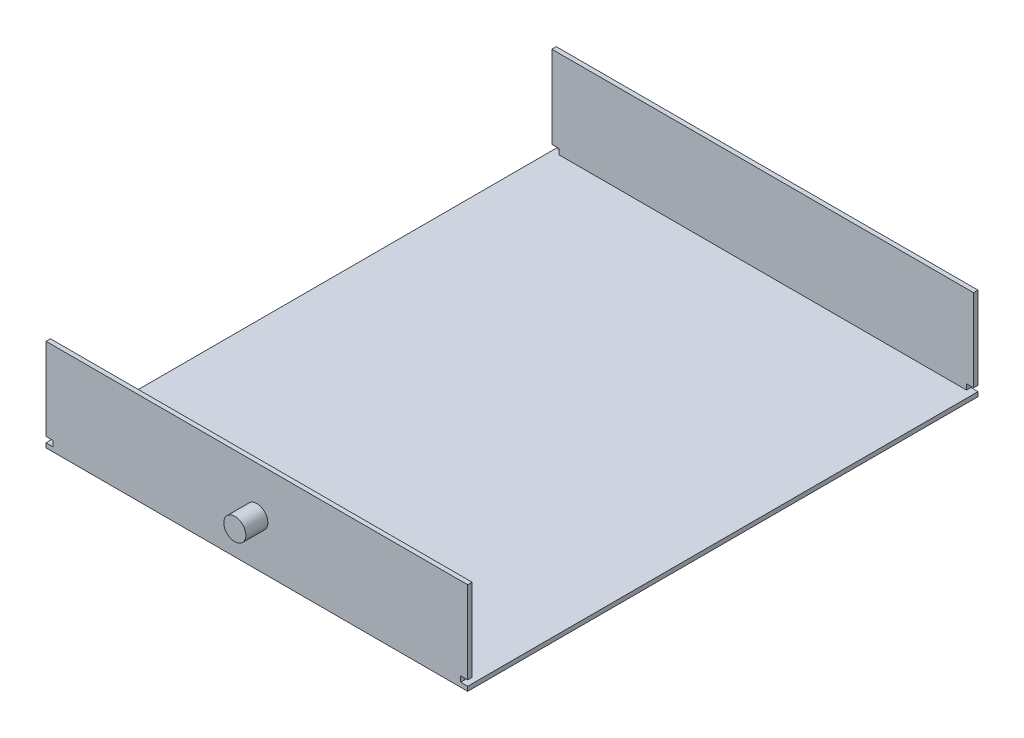
ISO-10303-21;
HEADER;
FILE_DESCRIPTION(('STEP AP214'),'2;1');
FILE_NAME('part.step','',(''),(''),'','','');
FILE_SCHEMA(('AUTOMOTIVE_DESIGN { 1 0 10303 214 1 1 1 1 }'));
ENDSEC;
DATA;
#1=APPLICATION_CONTEXT('core data for automotive mechanical design processes');
#2=APPLICATION_PROTOCOL_DEFINITION('international standard','automotive_design',2000,#1);
#3=PRODUCT_CONTEXT('',#1,'mechanical');
#4=PRODUCT('Part','Part','',(#3));
#5=PRODUCT_RELATED_PRODUCT_CATEGORY('part','',(#4));
#6=PRODUCT_DEFINITION_FORMATION('','',#4);
#7=PRODUCT_DEFINITION_CONTEXT('part definition',#1,'design');
#8=PRODUCT_DEFINITION('design','',#6,#7);
#9=PRODUCT_DEFINITION_SHAPE('','',#8);
#10=(LENGTH_UNIT() NAMED_UNIT(*) SI_UNIT(.MILLI.,.METRE.));
#11=(NAMED_UNIT(*) PLANE_ANGLE_UNIT() SI_UNIT($,.RADIAN.));
#12=(NAMED_UNIT(*) SI_UNIT($,.STERADIAN.) SOLID_ANGLE_UNIT());
#13=UNCERTAINTY_MEASURE_WITH_UNIT(LENGTH_MEASURE(1.E-05),#10,'distance_accuracy_value','');
#14=(GEOMETRIC_REPRESENTATION_CONTEXT(3) GLOBAL_UNCERTAINTY_ASSIGNED_CONTEXT((#13)) GLOBAL_UNIT_ASSIGNED_CONTEXT((#10,
#11,#12)) REPRESENTATION_CONTEXT('',''));
#15=CARTESIAN_POINT('',(0.,0.,0.));
#16=DIRECTION('',(0.,0.,1.));
#17=DIRECTION('',(1.,0.,0.));
#18=AXIS2_PLACEMENT_3D('',#15,#16,#17);
#19=CARTESIAN_POINT('',(0.,2.,0.));
#20=DIRECTION('',(0.,1.,0.));
#21=DIRECTION('',(0.,0.,1.));
#22=AXIS2_PLACEMENT_3D('',#19,#20,#21);
#23=PLANE('',#22);
#24=DIRECTION('',(1.,0.,0.));
#25=VECTOR('',#24,1.);
#26=CARTESIAN_POINT('',(95.7,2.,115.8));
#27=LINE('',#26,#25);
#28=CARTESIAN_POINT('',(-95.7,2.,115.8));
#29=VERTEX_POINT('',#28);
#30=CARTESIAN_POINT('',(-92.5000000000001,2.,115.8));
#31=VERTEX_POINT('',#30);
#32=EDGE_CURVE('E340',#29,#31,#27,.T.);
#33=ORIENTED_EDGE('',*,*,#32,.T.);
#34=DIRECTION('',(0.,0.,1.));
#35=VECTOR('',#34,1.);
#36=CARTESIAN_POINT('',(-92.5000000000001,2.,115.8));
#37=LINE('',#36,#35);
#38=CARTESIAN_POINT('',(-92.5000000000001,2.,113.8));
#39=VERTEX_POINT('',#38);
#40=EDGE_CURVE('E291',#39,#31,#37,.T.);
#41=ORIENTED_EDGE('',*,*,#40,.F.);
#42=DIRECTION('',(-1.,0.,0.));
#43=VECTOR('',#42,1.);
#44=CARTESIAN_POINT('',(-92.5000000000001,2.,113.8));
#45=LINE('',#44,#43);
#46=CARTESIAN_POINT('',(92.4999999999998,2.,113.8));
#47=VERTEX_POINT('',#46);
#48=EDGE_CURVE('E284',#47,#39,#45,.T.);
#49=ORIENTED_EDGE('',*,*,#48,.F.);
#50=DIRECTION('',(0.,0.,-1.));
#51=VECTOR('',#50,1.);
#52=CARTESIAN_POINT('',(92.4999999999998,2.,115.8));
#53=LINE('',#52,#51);
#54=CARTESIAN_POINT('',(92.4999999999998,2.,115.8));
#55=VERTEX_POINT('',#54);
#56=EDGE_CURVE('E287',#55,#47,#53,.T.);
#57=ORIENTED_EDGE('',*,*,#56,.F.);
#58=CARTESIAN_POINT('',(95.7,2.,115.8));
#59=VERTEX_POINT('',#58);
#60=EDGE_CURVE('E338',#55,#59,#27,.T.);
#61=ORIENTED_EDGE('',*,*,#60,.T.);
#62=DIRECTION('',(0.,0.,-1.));
#63=VECTOR('',#62,1.);
#64=CARTESIAN_POINT('',(95.7,2.,115.8));
#65=LINE('',#64,#63);
#66=CARTESIAN_POINT('',(95.7,2.,-115.8));
#67=VERTEX_POINT('',#66);
#68=EDGE_CURVE('E344',#59,#67,#65,.T.);
#69=ORIENTED_EDGE('',*,*,#68,.T.);
#70=DIRECTION('',(-1.,0.,0.));
#71=VECTOR('',#70,1.);
#72=CARTESIAN_POINT('',(95.7,2.,-115.8));
#73=LINE('',#72,#71);
#74=CARTESIAN_POINT('',(92.5,2.,-115.8));
#75=VERTEX_POINT('',#74);
#76=EDGE_CURVE('E348',#67,#75,#73,.T.);
#77=ORIENTED_EDGE('',*,*,#76,.T.);
#78=DIRECTION('',(0.,0.,-1.));
#79=VECTOR('',#78,1.);
#80=CARTESIAN_POINT('',(92.5,2.,-115.8));
#81=LINE('',#80,#79);
#82=CARTESIAN_POINT('',(92.5,2.,-113.8));
#83=VERTEX_POINT('',#82);
#84=EDGE_CURVE('E306',#83,#75,#81,.T.);
#85=ORIENTED_EDGE('',*,*,#84,.F.);
#86=DIRECTION('',(1.,0.,0.));
#87=VECTOR('',#86,1.);
#88=CARTESIAN_POINT('',(-92.5,2.,-113.8));
#89=LINE('',#88,#87);
#90=CARTESIAN_POINT('',(-92.5,2.,-113.8));
#91=VERTEX_POINT('',#90);
#92=EDGE_CURVE('E67',#91,#83,#89,.T.);
#93=ORIENTED_EDGE('',*,*,#92,.F.);
#94=DIRECTION('',(0.,0.,1.));
#95=VECTOR('',#94,1.);
#96=CARTESIAN_POINT('',(-92.5,2.,-115.8));
#97=LINE('',#96,#95);
#98=CARTESIAN_POINT('',(-92.5,2.,-115.8));
#99=VERTEX_POINT('',#98);
#100=EDGE_CURVE('E295',#99,#91,#97,.T.);
#101=ORIENTED_EDGE('',*,*,#100,.F.);
#102=CARTESIAN_POINT('',(-95.7,2.,-115.8));
#103=VERTEX_POINT('',#102);
#104=EDGE_CURVE('E347',#99,#103,#73,.T.);
#105=ORIENTED_EDGE('',*,*,#104,.T.);
#106=DIRECTION('',(0.,0.,1.));
#107=VECTOR('',#106,1.);
#108=CARTESIAN_POINT('',(-95.7,2.,115.8));
#109=LINE('',#108,#107);
#110=EDGE_CURVE('E334',#103,#29,#109,.T.);
#111=ORIENTED_EDGE('',*,*,#110,.T.);
#112=EDGE_LOOP('',(#33,#41,#49,#57,#61,#69,#77,#85,#93,#101,#105,#111));
#113=FACE_BOUND('',#112,.T.);
#114=ADVANCED_FACE('F43',(#113),#23,.T.);
#115=CARTESIAN_POINT('',(-95.7,2.,115.8));
#116=DIRECTION('',(1.,0.,0.));
#117=DIRECTION('',(0.,0.,-1.));
#118=AXIS2_PLACEMENT_3D('',#115,#116,#117);
#119=PLANE('',#118);
#120=DIRECTION('',(0.,0.,1.));
#121=VECTOR('',#120,1.);
#122=CARTESIAN_POINT('',(-95.7,0.,115.8));
#123=LINE('',#122,#121);
#124=CARTESIAN_POINT('',(-95.7,0.,-115.8));
#125=VERTEX_POINT('',#124);
#126=CARTESIAN_POINT('',(-95.7,0.,115.8));
#127=VERTEX_POINT('',#126);
#128=EDGE_CURVE('E333',#125,#127,#123,.T.);
#129=ORIENTED_EDGE('',*,*,#128,.T.);
#130=DIRECTION('',(0.,-1.,0.));
#131=VECTOR('',#130,1.);
#132=CARTESIAN_POINT('',(-95.7,2.,115.8));
#133=LINE('',#132,#131);
#134=EDGE_CURVE('E52',#29,#127,#133,.T.);
#135=ORIENTED_EDGE('',*,*,#134,.F.);
#136=ORIENTED_EDGE('',*,*,#110,.F.);
#137=DIRECTION('',(0.,-1.,0.));
#138=VECTOR('',#137,1.);
#139=CARTESIAN_POINT('',(-95.7,2.,-115.8));
#140=LINE('',#139,#138);
#141=EDGE_CURVE('E351',#103,#125,#140,.T.);
#142=ORIENTED_EDGE('',*,*,#141,.T.);
#143=EDGE_LOOP('',(#129,#135,#136,#142));
#144=FACE_BOUND('',#143,.T.);
#145=ADVANCED_FACE('F45',(#144),#119,.F.);
#146=CARTESIAN_POINT('',(95.7,2.,115.8));
#147=DIRECTION('',(0.,0.,-1.));
#148=DIRECTION('',(-1.,0.,0.));
#149=AXIS2_PLACEMENT_3D('',#146,#147,#148);
#150=PLANE('',#149);
#151=CARTESIAN_POINT('',(0.,20.95,115.8));
#152=DIRECTION('',(0.,0.,-1.));
#153=DIRECTION('',(-1.,0.,0.));
#154=AXIS2_PLACEMENT_3D('',#151,#152,#153);
#155=CIRCLE('',#154,5.);
#156=CARTESIAN_POINT('',(-5.00000000000006,20.95,115.8));
#157=VERTEX_POINT('',#156);
#158=EDGE_CURVE('E11',#157,#157,#155,.F.);
#159=ORIENTED_EDGE('',*,*,#158,.F.);
#160=EDGE_LOOP('',(#159));
#161=FACE_BOUND('',#160,.T.);
#162=DIRECTION('',(1.,0.,0.));
#163=VECTOR('',#162,1.);
#164=CARTESIAN_POINT('',(95.7,0.,115.8));
#165=LINE('',#164,#163);
#166=CARTESIAN_POINT('',(95.7,0.,115.8));
#167=VERTEX_POINT('',#166);
#168=EDGE_CURVE('E355',#127,#167,#165,.T.);
#169=ORIENTED_EDGE('',*,*,#168,.T.);
#170=DIRECTION('',(0.,-1.,0.));
#171=VECTOR('',#170,1.);
#172=CARTESIAN_POINT('',(95.7,2.,115.8));
#173=LINE('',#172,#171);
#174=EDGE_CURVE('E370',#59,#167,#173,.T.);
#175=ORIENTED_EDGE('',*,*,#174,.F.);
#176=ORIENTED_EDGE('',*,*,#60,.F.);
#177=DIRECTION('',(0.,-1.,0.));
#178=VECTOR('',#177,1.);
#179=CARTESIAN_POINT('',(92.4999999999998,4.5,115.8));
#180=LINE('',#179,#178);
#181=CARTESIAN_POINT('',(92.4999999999998,4.5,115.8));
#182=VERTEX_POINT('',#181);
#183=EDGE_CURVE('E276',#182,#55,#180,.T.);
#184=ORIENTED_EDGE('',*,*,#183,.F.);
#185=DIRECTION('',(1.,0.,0.));
#186=VECTOR('',#185,1.);
#187=CARTESIAN_POINT('',(-95.7000000000001,4.5,115.8));
#188=LINE('',#187,#186);
#189=CARTESIAN_POINT('',(95.6999999999998,4.5,115.8));
#190=VERTEX_POINT('',#189);
#191=EDGE_CURVE('E218',#182,#190,#188,.T.);
#192=ORIENTED_EDGE('',*,*,#191,.T.);
#193=DIRECTION('',(0.,-1.,0.));
#194=VECTOR('',#193,1.);
#195=CARTESIAN_POINT('',(95.6999999999998,41.9,115.8));
#196=LINE('',#195,#194);
#197=CARTESIAN_POINT('',(95.6999999999998,41.9,115.8));
#198=VERTEX_POINT('',#197);
#199=EDGE_CURVE('E711',#198,#190,#196,.T.);
#200=ORIENTED_EDGE('',*,*,#199,.F.);
#201=DIRECTION('',(1.,0.,0.));
#202=VECTOR('',#201,1.);
#203=CARTESIAN_POINT('',(-95.7000000000001,41.9,115.8));
#204=LINE('',#203,#202);
#205=CARTESIAN_POINT('',(-95.7000000000001,41.9,115.8));
#206=VERTEX_POINT('',#205);
#207=EDGE_CURVE('E227',#206,#198,#204,.T.);
#208=ORIENTED_EDGE('',*,*,#207,.F.);
#209=DIRECTION('',(0.,-1.,0.));
#210=VECTOR('',#209,1.);
#211=CARTESIAN_POINT('',(-95.7000000000001,41.9,115.8));
#212=LINE('',#211,#210);
#213=CARTESIAN_POINT('',(-95.7000000000001,4.5,115.8));
#214=VERTEX_POINT('',#213);
#215=EDGE_CURVE('E714',#206,#214,#212,.T.);
#216=ORIENTED_EDGE('',*,*,#215,.T.);
#217=CARTESIAN_POINT('',(-92.5000000000001,4.5,115.8));
#218=VERTEX_POINT('',#217);
#219=EDGE_CURVE('E208',#214,#218,#188,.T.);
#220=ORIENTED_EDGE('',*,*,#219,.T.);
#221=DIRECTION('',(0.,-1.,0.));
#222=VECTOR('',#221,1.);
#223=CARTESIAN_POINT('',(-92.5000000000001,4.5,115.8));
#224=LINE('',#223,#222);
#225=EDGE_CURVE('E273',#218,#31,#224,.T.);
#226=ORIENTED_EDGE('',*,*,#225,.T.);
#227=ORIENTED_EDGE('',*,*,#32,.F.);
#228=ORIENTED_EDGE('',*,*,#134,.T.);
#229=EDGE_LOOP('',(#169,#175,#176,#184,#192,#200,#208,#216,#220,#226,#227,#228));
#230=FACE_BOUND('',#229,.T.);
#231=ADVANCED_FACE('F377',(#161,#230),#150,.F.);
#232=CARTESIAN_POINT('',(95.7,2.,115.8));
#233=DIRECTION('',(-1.,0.,0.));
#234=DIRECTION('',(0.,0.,1.));
#235=AXIS2_PLACEMENT_3D('',#232,#233,#234);
#236=PLANE('',#235);
#237=DIRECTION('',(0.,0.,-1.));
#238=VECTOR('',#237,1.);
#239=CARTESIAN_POINT('',(95.7,0.,115.8));
#240=LINE('',#239,#238);
#241=CARTESIAN_POINT('',(95.7,0.,-115.8));
#242=VERTEX_POINT('',#241);
#243=EDGE_CURVE('E358',#167,#242,#240,.T.);
#244=ORIENTED_EDGE('',*,*,#243,.T.);
#245=DIRECTION('',(0.,-1.,0.));
#246=VECTOR('',#245,1.);
#247=CARTESIAN_POINT('',(95.7,2.,-115.8));
#248=LINE('',#247,#246);
#249=EDGE_CURVE('E366',#67,#242,#248,.T.);
#250=ORIENTED_EDGE('',*,*,#249,.F.);
#251=ORIENTED_EDGE('',*,*,#68,.F.);
#252=ORIENTED_EDGE('',*,*,#174,.T.);
#253=EDGE_LOOP('',(#244,#250,#251,#252));
#254=FACE_BOUND('',#253,.T.);
#255=ADVANCED_FACE('F389',(#254),#236,.F.);
#256=CARTESIAN_POINT('',(95.7,2.,-115.8));
#257=DIRECTION('',(0.,0.,1.));
#258=DIRECTION('',(1.,0.,0.));
#259=AXIS2_PLACEMENT_3D('',#256,#257,#258);
#260=PLANE('',#259);
#261=DIRECTION('',(-1.,0.,0.));
#262=VECTOR('',#261,1.);
#263=CARTESIAN_POINT('',(95.7,0.,-115.8));
#264=LINE('',#263,#262);
#265=EDGE_CURVE('E339',#242,#125,#264,.T.);
#266=ORIENTED_EDGE('',*,*,#265,.T.);
#267=ORIENTED_EDGE('',*,*,#141,.F.);
#268=ORIENTED_EDGE('',*,*,#104,.F.);
#269=DIRECTION('',(0.,-1.,0.));
#270=VECTOR('',#269,1.);
#271=CARTESIAN_POINT('',(-92.5,4.5,-115.8));
#272=LINE('',#271,#270);
#273=CARTESIAN_POINT('',(-92.5,4.5,-115.8));
#274=VERTEX_POINT('',#273);
#275=EDGE_CURVE('E310',#274,#99,#272,.T.);
#276=ORIENTED_EDGE('',*,*,#275,.F.);
#277=DIRECTION('',(-1.,0.,0.));
#278=VECTOR('',#277,1.);
#279=CARTESIAN_POINT('',(-95.7,4.5,-115.8));
#280=LINE('',#279,#278);
#281=CARTESIAN_POINT('',(-95.7,4.5,-115.8));
#282=VERTEX_POINT('',#281);
#283=EDGE_CURVE('E254',#274,#282,#280,.T.);
#284=ORIENTED_EDGE('',*,*,#283,.T.);
#285=DIRECTION('',(0.,-1.,0.));
#286=VECTOR('',#285,1.);
#287=CARTESIAN_POINT('',(-95.7,41.9,-115.8));
#288=LINE('',#287,#286);
#289=CARTESIAN_POINT('',(-95.7,41.9,-115.8));
#290=VERTEX_POINT('',#289);
#291=EDGE_CURVE('E245',#290,#282,#288,.T.);
#292=ORIENTED_EDGE('',*,*,#291,.F.);
#293=DIRECTION('',(-1.,0.,0.));
#294=VECTOR('',#293,1.);
#295=CARTESIAN_POINT('',(-95.7,41.9,-115.8));
#296=LINE('',#295,#294);
#297=CARTESIAN_POINT('',(95.7,41.9,-115.8));
#298=VERTEX_POINT('',#297);
#299=EDGE_CURVE('E243',#298,#290,#296,.T.);
#300=ORIENTED_EDGE('',*,*,#299,.F.);
#301=DIRECTION('',(0.,-1.,0.));
#302=VECTOR('',#301,1.);
#303=CARTESIAN_POINT('',(95.7,41.9,-115.8));
#304=LINE('',#303,#302);
#305=CARTESIAN_POINT('',(95.7,4.5,-115.8));
#306=VERTEX_POINT('',#305);
#307=EDGE_CURVE('E261',#298,#306,#304,.T.);
#308=ORIENTED_EDGE('',*,*,#307,.T.);
#309=CARTESIAN_POINT('',(92.5,4.5,-115.8));
#310=VERTEX_POINT('',#309);
#311=EDGE_CURVE('E237',#306,#310,#280,.T.);
#312=ORIENTED_EDGE('',*,*,#311,.T.);
#313=DIRECTION('',(0.,-1.,0.));
#314=VECTOR('',#313,1.);
#315=CARTESIAN_POINT('',(92.5,4.5,-115.8));
#316=LINE('',#315,#314);
#317=EDGE_CURVE('E322',#310,#75,#316,.T.);
#318=ORIENTED_EDGE('',*,*,#317,.T.);
#319=ORIENTED_EDGE('',*,*,#76,.F.);
#320=ORIENTED_EDGE('',*,*,#249,.T.);
#321=EDGE_LOOP('',(#266,#267,#268,#276,#284,#292,#300,#308,#312,#318,#319,#320));
#322=FACE_BOUND('',#321,.T.);
#323=ADVANCED_FACE('F393',(#322),#260,.F.);
#324=CARTESIAN_POINT('',(0.,0.,0.));
#325=DIRECTION('',(0.,1.,0.));
#326=DIRECTION('',(0.,0.,1.));
#327=AXIS2_PLACEMENT_3D('',#324,#325,#326);
#328=PLANE('',#327);
#329=ORIENTED_EDGE('',*,*,#128,.F.);
#330=ORIENTED_EDGE('',*,*,#265,.F.);
#331=ORIENTED_EDGE('',*,*,#243,.F.);
#332=ORIENTED_EDGE('',*,*,#168,.F.);
#333=EDGE_LOOP('',(#329,#330,#331,#332));
#334=FACE_BOUND('',#333,.T.);
#335=ADVANCED_FACE('F385',(#334),#328,.F.);
#336=CARTESIAN_POINT('',(-92.5,4.5,-115.8));
#337=DIRECTION('',(1.,0.,0.));
#338=DIRECTION('',(0.,0.,-1.));
#339=AXIS2_PLACEMENT_3D('',#336,#337,#338);
#340=PLANE('',#339);
#341=ORIENTED_EDGE('',*,*,#100,.T.);
#342=DIRECTION('',(0.,-1.,0.));
#343=VECTOR('',#342,1.);
#344=CARTESIAN_POINT('',(-92.5,4.5,-113.8));
#345=LINE('',#344,#343);
#346=CARTESIAN_POINT('',(-92.5,4.5,-113.8));
#347=VERTEX_POINT('',#346);
#348=EDGE_CURVE('E330',#347,#91,#345,.T.);
#349=ORIENTED_EDGE('',*,*,#348,.F.);
#350=DIRECTION('',(0.,0.,1.));
#351=VECTOR('',#350,1.);
#352=CARTESIAN_POINT('',(-92.5,4.5,-115.8));
#353=LINE('',#352,#351);
#354=EDGE_CURVE('E301',#274,#347,#353,.T.);
#355=ORIENTED_EDGE('',*,*,#354,.F.);
#356=ORIENTED_EDGE('',*,*,#275,.T.);
#357=EDGE_LOOP('',(#341,#349,#355,#356));
#358=FACE_BOUND('',#357,.T.);
#359=ADVANCED_FACE('F403',(#358),#340,.F.);
#360=CARTESIAN_POINT('',(-92.5,4.5,-113.8));
#361=DIRECTION('',(0.,0.,-1.));
#362=DIRECTION('',(-1.,0.,0.));
#363=AXIS2_PLACEMENT_3D('',#360,#361,#362);
#364=PLANE('',#363);
#365=ORIENTED_EDGE('',*,*,#92,.T.);
#366=DIRECTION('',(0.,-1.,0.));
#367=VECTOR('',#366,1.);
#368=CARTESIAN_POINT('',(92.5,4.5,-113.8));
#369=LINE('',#368,#367);
#370=CARTESIAN_POINT('',(92.5,4.5,-113.8));
#371=VERTEX_POINT('',#370);
#372=EDGE_CURVE('E326',#371,#83,#369,.T.);
#373=ORIENTED_EDGE('',*,*,#372,.F.);
#374=DIRECTION('',(1.,0.,0.));
#375=VECTOR('',#374,1.);
#376=CARTESIAN_POINT('',(-95.7,4.5,-113.8));
#377=LINE('',#376,#375);
#378=CARTESIAN_POINT('',(95.7,4.5,-113.8));
#379=VERTEX_POINT('',#378);
#380=EDGE_CURVE('E216',#371,#379,#377,.T.);
#381=ORIENTED_EDGE('',*,*,#380,.T.);
#382=DIRECTION('',(0.,-1.,0.));
#383=VECTOR('',#382,1.);
#384=CARTESIAN_POINT('',(95.7,41.9,-113.8));
#385=LINE('',#384,#383);
#386=CARTESIAN_POINT('',(95.7,41.9,-113.8));
#387=VERTEX_POINT('',#386);
#388=EDGE_CURVE('E265',#387,#379,#385,.T.);
#389=ORIENTED_EDGE('',*,*,#388,.F.);
#390=DIRECTION('',(1.,0.,0.));
#391=VECTOR('',#390,1.);
#392=CARTESIAN_POINT('',(-95.7,41.9,-113.8));
#393=LINE('',#392,#391);
#394=CARTESIAN_POINT('',(-95.7,41.9,-113.8));
#395=VERTEX_POINT('',#394);
#396=EDGE_CURVE('E236',#395,#387,#393,.T.);
#397=ORIENTED_EDGE('',*,*,#396,.F.);
#398=DIRECTION('',(0.,-1.,0.));
#399=VECTOR('',#398,1.);
#400=CARTESIAN_POINT('',(-95.7,41.9,-113.8));
#401=LINE('',#400,#399);
#402=CARTESIAN_POINT('',(-95.7,4.5,-113.8));
#403=VERTEX_POINT('',#402);
#404=EDGE_CURVE('E269',#395,#403,#401,.T.);
#405=ORIENTED_EDGE('',*,*,#404,.T.);
#406=EDGE_CURVE('E247',#403,#347,#377,.T.);
#407=ORIENTED_EDGE('',*,*,#406,.T.);
#408=ORIENTED_EDGE('',*,*,#348,.T.);
#409=EDGE_LOOP('',(#365,#373,#381,#389,#397,#405,#407,#408));
#410=FACE_BOUND('',#409,.T.);
#411=ADVANCED_FACE('F399',(#410),#364,.F.);
#412=CARTESIAN_POINT('',(92.5,4.5,-115.8));
#413=DIRECTION('',(-1.,0.,0.));
#414=DIRECTION('',(0.,0.,1.));
#415=AXIS2_PLACEMENT_3D('',#412,#413,#414);
#416=PLANE('',#415);
#417=ORIENTED_EDGE('',*,*,#84,.T.);
#418=ORIENTED_EDGE('',*,*,#317,.F.);
#419=DIRECTION('',(0.,0.,-1.));
#420=VECTOR('',#419,1.);
#421=CARTESIAN_POINT('',(92.5,4.5,-115.8));
#422=LINE('',#421,#420);
#423=EDGE_CURVE('E305',#371,#310,#422,.T.);
#424=ORIENTED_EDGE('',*,*,#423,.F.);
#425=ORIENTED_EDGE('',*,*,#372,.T.);
#426=EDGE_LOOP('',(#417,#418,#424,#425));
#427=FACE_BOUND('',#426,.T.);
#428=ADVANCED_FACE('F395',(#427),#416,.F.);
#429=CARTESIAN_POINT('',(-92.5000000000001,4.5,115.8));
#430=DIRECTION('',(1.,0.,0.));
#431=DIRECTION('',(0.,0.,-1.));
#432=AXIS2_PLACEMENT_3D('',#429,#430,#431);
#433=PLANE('',#432);
#434=ORIENTED_EDGE('',*,*,#40,.T.);
#435=ORIENTED_EDGE('',*,*,#225,.F.);
#436=DIRECTION('',(0.,0.,1.));
#437=VECTOR('',#436,1.);
#438=CARTESIAN_POINT('',(-92.5000000000001,4.5,115.8));
#439=LINE('',#438,#437);
#440=CARTESIAN_POINT('',(-92.5000000000001,4.5,113.8));
#441=VERTEX_POINT('',#440);
#442=EDGE_CURVE('E288',#441,#218,#439,.T.);
#443=ORIENTED_EDGE('',*,*,#442,.F.);
#444=DIRECTION('',(0.,-1.,0.));
#445=VECTOR('',#444,1.);
#446=CARTESIAN_POINT('',(-92.5000000000001,4.5,113.8));
#447=LINE('',#446,#445);
#448=EDGE_CURVE('E187',#441,#39,#447,.T.);
#449=ORIENTED_EDGE('',*,*,#448,.T.);
#450=EDGE_LOOP('',(#434,#435,#443,#449));
#451=FACE_BOUND('',#450,.T.);
#452=ADVANCED_FACE('F492',(#451),#433,.F.);
#453=CARTESIAN_POINT('',(92.4999999999998,4.5,115.8));
#454=DIRECTION('',(-1.,0.,0.));
#455=DIRECTION('',(0.,0.,1.));
#456=AXIS2_PLACEMENT_3D('',#453,#454,#455);
#457=PLANE('',#456);
#458=ORIENTED_EDGE('',*,*,#56,.T.);
#459=DIRECTION('',(0.,-1.,0.));
#460=VECTOR('',#459,1.);
#461=CARTESIAN_POINT('',(92.4999999999998,4.5,113.8));
#462=LINE('',#461,#460);
#463=CARTESIAN_POINT('',(92.4999999999998,4.5,113.8));
#464=VERTEX_POINT('',#463);
#465=EDGE_CURVE('E59',#464,#47,#462,.T.);
#466=ORIENTED_EDGE('',*,*,#465,.F.);
#467=DIRECTION('',(0.,0.,-1.));
#468=VECTOR('',#467,1.);
#469=CARTESIAN_POINT('',(92.4999999999998,4.5,115.8));
#470=LINE('',#469,#468);
#471=EDGE_CURVE('E283',#182,#464,#470,.T.);
#472=ORIENTED_EDGE('',*,*,#471,.F.);
#473=ORIENTED_EDGE('',*,*,#183,.T.);
#474=EDGE_LOOP('',(#458,#466,#472,#473));
#475=FACE_BOUND('',#474,.T.);
#476=ADVANCED_FACE('F487',(#475),#457,.F.);
#477=CARTESIAN_POINT('',(-92.5000000000001,4.5,113.8));
#478=DIRECTION('',(0.,0.,1.));
#479=DIRECTION('',(1.,0.,0.));
#480=AXIS2_PLACEMENT_3D('',#477,#478,#479);
#481=PLANE('',#480);
#482=ORIENTED_EDGE('',*,*,#48,.T.);
#483=ORIENTED_EDGE('',*,*,#448,.F.);
#484=DIRECTION('',(-1.,0.,0.));
#485=VECTOR('',#484,1.);
#486=CARTESIAN_POINT('',(-95.7000000000001,4.5,113.8));
#487=LINE('',#486,#485);
#488=CARTESIAN_POINT('',(-95.7000000000001,4.5,113.8));
#489=VERTEX_POINT('',#488);
#490=EDGE_CURVE('E180',#441,#489,#487,.T.);
#491=ORIENTED_EDGE('',*,*,#490,.T.);
#492=DIRECTION('',(0.,-1.,0.));
#493=VECTOR('',#492,1.);
#494=CARTESIAN_POINT('',(-95.7000000000001,41.9,113.8));
#495=LINE('',#494,#493);
#496=CARTESIAN_POINT('',(-95.7000000000001,41.9,113.8));
#497=VERTEX_POINT('',#496);
#498=EDGE_CURVE('E184',#497,#489,#495,.T.);
#499=ORIENTED_EDGE('',*,*,#498,.F.);
#500=DIRECTION('',(-1.,0.,0.));
#501=VECTOR('',#500,1.);
#502=CARTESIAN_POINT('',(-95.7000000000001,41.9,113.8));
#503=LINE('',#502,#501);
#504=CARTESIAN_POINT('',(95.6999999999998,41.9,113.8));
#505=VERTEX_POINT('',#504);
#506=EDGE_CURVE('E203',#505,#497,#503,.T.);
#507=ORIENTED_EDGE('',*,*,#506,.F.);
#508=DIRECTION('',(0.,-1.,0.));
#509=VECTOR('',#508,1.);
#510=CARTESIAN_POINT('',(95.6999999999998,41.9,113.8));
#511=LINE('',#510,#509);
#512=CARTESIAN_POINT('',(95.6999999999998,4.5,113.8));
#513=VERTEX_POINT('',#512);
#514=EDGE_CURVE('E204',#505,#513,#511,.T.);
#515=ORIENTED_EDGE('',*,*,#514,.T.);
#516=EDGE_CURVE('E193',#513,#464,#487,.T.);
#517=ORIENTED_EDGE('',*,*,#516,.T.);
#518=ORIENTED_EDGE('',*,*,#465,.T.);
#519=EDGE_LOOP('',(#482,#483,#491,#499,#507,#515,#517,#518));
#520=FACE_BOUND('',#519,.T.);
#521=ADVANCED_FACE('F182',(#520),#481,.F.);
#522=CARTESIAN_POINT('',(0.,4.5,0.));
#523=DIRECTION('',(0.,1.,0.));
#524=DIRECTION('',(0.,0.,1.));
#525=AXIS2_PLACEMENT_3D('',#522,#523,#524);
#526=PLANE('',#525);
#527=ORIENTED_EDGE('',*,*,#283,.F.);
#528=ORIENTED_EDGE('',*,*,#354,.T.);
#529=ORIENTED_EDGE('',*,*,#406,.F.);
#530=DIRECTION('',(0.,0.,1.));
#531=VECTOR('',#530,1.);
#532=CARTESIAN_POINT('',(-95.7,4.5,-115.8));
#533=LINE('',#532,#531);
#534=EDGE_CURVE('E211',#282,#403,#533,.T.);
#535=ORIENTED_EDGE('',*,*,#534,.F.);
#536=EDGE_LOOP('',(#527,#528,#529,#535));
#537=FACE_BOUND('',#536,.T.);
#538=ADVANCED_FACE('F418',(#537),#526,.F.);
#539=ORIENTED_EDGE('',*,*,#380,.F.);
#540=ORIENTED_EDGE('',*,*,#423,.T.);
#541=ORIENTED_EDGE('',*,*,#311,.F.);
#542=DIRECTION('',(0.,0.,-1.));
#543=VECTOR('',#542,1.);
#544=CARTESIAN_POINT('',(95.7,4.5,-115.8));
#545=LINE('',#544,#543);
#546=EDGE_CURVE('E251',#379,#306,#545,.T.);
#547=ORIENTED_EDGE('',*,*,#546,.F.);
#548=EDGE_LOOP('',(#539,#540,#541,#547));
#549=FACE_BOUND('',#548,.T.);
#550=ADVANCED_FACE('F427',(#549),#526,.F.);
#551=CARTESIAN_POINT('',(-95.7,41.9,-115.8));
#552=DIRECTION('',(1.,0.,0.));
#553=DIRECTION('',(0.,0.,-1.));
#554=AXIS2_PLACEMENT_3D('',#551,#552,#553);
#555=PLANE('',#554);
#556=ORIENTED_EDGE('',*,*,#534,.T.);
#557=ORIENTED_EDGE('',*,*,#404,.F.);
#558=DIRECTION('',(0.,0.,1.));
#559=VECTOR('',#558,1.);
#560=CARTESIAN_POINT('',(-95.7,41.9,-115.8));
#561=LINE('',#560,#559);
#562=EDGE_CURVE('E232',#290,#395,#561,.T.);
#563=ORIENTED_EDGE('',*,*,#562,.F.);
#564=ORIENTED_EDGE('',*,*,#291,.T.);
#565=EDGE_LOOP('',(#556,#557,#563,#564));
#566=FACE_BOUND('',#565,.T.);
#567=ADVANCED_FACE('F416',(#566),#555,.F.);
#568=CARTESIAN_POINT('',(95.7,41.9,-115.8));
#569=DIRECTION('',(-1.,0.,0.));
#570=DIRECTION('',(0.,0.,1.));
#571=AXIS2_PLACEMENT_3D('',#568,#569,#570);
#572=PLANE('',#571);
#573=ORIENTED_EDGE('',*,*,#546,.T.);
#574=ORIENTED_EDGE('',*,*,#307,.F.);
#575=DIRECTION('',(0.,0.,-1.));
#576=VECTOR('',#575,1.);
#577=CARTESIAN_POINT('',(95.7,41.9,-115.8));
#578=LINE('',#577,#576);
#579=EDGE_CURVE('E240',#387,#298,#578,.T.);
#580=ORIENTED_EDGE('',*,*,#579,.F.);
#581=ORIENTED_EDGE('',*,*,#388,.T.);
#582=EDGE_LOOP('',(#573,#574,#580,#581));
#583=FACE_BOUND('',#582,.T.);
#584=ADVANCED_FACE('F428',(#583),#572,.F.);
#585=CARTESIAN_POINT('',(0.,41.9,0.));
#586=DIRECTION('',(0.,1.,0.));
#587=DIRECTION('',(0.,0.,1.));
#588=AXIS2_PLACEMENT_3D('',#585,#586,#587);
#589=PLANE('',#588);
#590=ORIENTED_EDGE('',*,*,#562,.T.);
#591=ORIENTED_EDGE('',*,*,#396,.T.);
#592=ORIENTED_EDGE('',*,*,#579,.T.);
#593=ORIENTED_EDGE('',*,*,#299,.T.);
#594=EDGE_LOOP('',(#590,#591,#592,#593));
#595=FACE_BOUND('',#594,.T.);
#596=ADVANCED_FACE('F421',(#595),#589,.T.);
#597=CARTESIAN_POINT('',(0.,4.5,0.));
#598=DIRECTION('',(0.,-1.,0.));
#599=DIRECTION('',(0.,0.,-1.));
#600=AXIS2_PLACEMENT_3D('',#597,#598,#599);
#601=PLANE('',#600);
#602=ORIENTED_EDGE('',*,*,#490,.F.);
#603=ORIENTED_EDGE('',*,*,#442,.T.);
#604=ORIENTED_EDGE('',*,*,#219,.F.);
#605=DIRECTION('',(0.,0.,1.));
#606=VECTOR('',#605,1.);
#607=CARTESIAN_POINT('',(-95.7000000000001,4.5,115.8));
#608=LINE('',#607,#606);
#609=EDGE_CURVE('E200',#489,#214,#608,.T.);
#610=ORIENTED_EDGE('',*,*,#609,.F.);
#611=EDGE_LOOP('',(#602,#603,#604,#610));
#612=FACE_BOUND('',#611,.T.);
#613=ADVANCED_FACE('F206',(#612),#601,.T.);
#614=CARTESIAN_POINT('',(-95.7000000000001,41.9,115.8));
#615=DIRECTION('',(1.,0.,0.));
#616=DIRECTION('',(0.,0.,-1.));
#617=AXIS2_PLACEMENT_3D('',#614,#615,#616);
#618=PLANE('',#617);
#619=ORIENTED_EDGE('',*,*,#609,.T.);
#620=ORIENTED_EDGE('',*,*,#215,.F.);
#621=DIRECTION('',(0.,0.,1.));
#622=VECTOR('',#621,1.);
#623=CARTESIAN_POINT('',(-95.7000000000001,41.9,115.8));
#624=LINE('',#623,#622);
#625=EDGE_CURVE('E194',#497,#206,#624,.T.);
#626=ORIENTED_EDGE('',*,*,#625,.F.);
#627=ORIENTED_EDGE('',*,*,#498,.T.);
#628=EDGE_LOOP('',(#619,#620,#626,#627));
#629=FACE_BOUND('',#628,.T.);
#630=ADVANCED_FACE('F198',(#629),#618,.F.);
#631=CARTESIAN_POINT('',(95.6999999999998,41.9,115.8));
#632=DIRECTION('',(-1.,0.,0.));
#633=DIRECTION('',(0.,0.,1.));
#634=AXIS2_PLACEMENT_3D('',#631,#632,#633);
#635=PLANE('',#634);
#636=DIRECTION('',(0.,0.,-1.));
#637=VECTOR('',#636,1.);
#638=CARTESIAN_POINT('',(95.6999999999998,4.5,115.8));
#639=LINE('',#638,#637);
#640=EDGE_CURVE('E702',#190,#513,#639,.T.);
#641=ORIENTED_EDGE('',*,*,#640,.T.);
#642=ORIENTED_EDGE('',*,*,#514,.F.);
#643=DIRECTION('',(0.,0.,-1.));
#644=VECTOR('',#643,1.);
#645=CARTESIAN_POINT('',(95.6999999999998,41.9,115.8));
#646=LINE('',#645,#644);
#647=EDGE_CURVE('E224',#198,#505,#646,.T.);
#648=ORIENTED_EDGE('',*,*,#647,.F.);
#649=ORIENTED_EDGE('',*,*,#199,.T.);
#650=EDGE_LOOP('',(#641,#642,#648,#649));
#651=FACE_BOUND('',#650,.T.);
#652=ADVANCED_FACE('F476',(#651),#635,.F.);
#653=CARTESIAN_POINT('',(0.,41.9,0.));
#654=DIRECTION('',(0.,-1.,0.));
#655=DIRECTION('',(0.,0.,-1.));
#656=AXIS2_PLACEMENT_3D('',#653,#654,#655);
#657=PLANE('',#656);
#658=ORIENTED_EDGE('',*,*,#625,.T.);
#659=ORIENTED_EDGE('',*,*,#207,.T.);
#660=ORIENTED_EDGE('',*,*,#647,.T.);
#661=ORIENTED_EDGE('',*,*,#506,.T.);
#662=EDGE_LOOP('',(#658,#659,#660,#661));
#663=FACE_BOUND('',#662,.T.);
#664=ADVANCED_FACE('F469',(#663),#657,.F.);
#665=ORIENTED_EDGE('',*,*,#191,.F.);
#666=ORIENTED_EDGE('',*,*,#471,.T.);
#667=ORIENTED_EDGE('',*,*,#516,.F.);
#668=ORIENTED_EDGE('',*,*,#640,.F.);
#669=EDGE_LOOP('',(#665,#666,#667,#668));
#670=FACE_BOUND('',#669,.T.);
#671=ADVANCED_FACE('F460',(#670),#601,.T.);
#672=CARTESIAN_POINT('',(0.,20.95,125.8));
#673=DIRECTION('',(0.,0.,-1.));
#674=DIRECTION('',(-1.,0.,0.));
#675=AXIS2_PLACEMENT_3D('',#672,#673,#674);
#676=CYLINDRICAL_SURFACE('',#675,5.);
#677=CARTESIAN_POINT('',(0.,20.95,125.8));
#678=DIRECTION('',(0.,0.,1.));
#679=DIRECTION('',(1.,0.,0.));
#680=AXIS2_PLACEMENT_3D('',#677,#678,#679);
#681=CIRCLE('',#680,5.);
#682=CARTESIAN_POINT('',(4.99999999999994,20.95,125.8));
#683=VERTEX_POINT('',#682);
#684=EDGE_CURVE('E717',#683,#683,#681,.T.);
#685=ORIENTED_EDGE('',*,*,#684,.F.);
#686=EDGE_LOOP('',(#685));
#687=FACE_BOUND('',#686,.T.);
#688=ORIENTED_EDGE('',*,*,#158,.T.);
#689=EDGE_LOOP('',(#688));
#690=FACE_BOUND('',#689,.T.);
#691=ADVANCED_FACE('F457',(#687,#690),#676,.T.);
#692=CARTESIAN_POINT('',(0.,20.95,125.8));
#693=DIRECTION('',(0.,0.,1.));
#694=DIRECTION('',(1.,0.,0.));
#695=AXIS2_PLACEMENT_3D('',#692,#693,#694);
#696=PLANE('',#695);
#697=ORIENTED_EDGE('',*,*,#684,.T.);
#698=EDGE_LOOP('',(#697));
#699=FACE_BOUND('',#698,.T.);
#700=ADVANCED_FACE('F459',(#699),#696,.T.);
#701=CLOSED_SHELL('',(#114,#145,#231,#255,#323,#335,#359,#411,#428,#452,#476,#521,#538,#550,
#567,#584,#596,#613,#630,#652,#664,#671,#691,#700));
#702=MANIFOLD_SOLID_BREP('B2',#701);
#703=ADVANCED_BREP_SHAPE_REPRESENTATION('',(#18,#702),#14);
#704=SHAPE_DEFINITION_REPRESENTATION(#9,#703);
ENDSEC;
END-ISO-10303-21;
